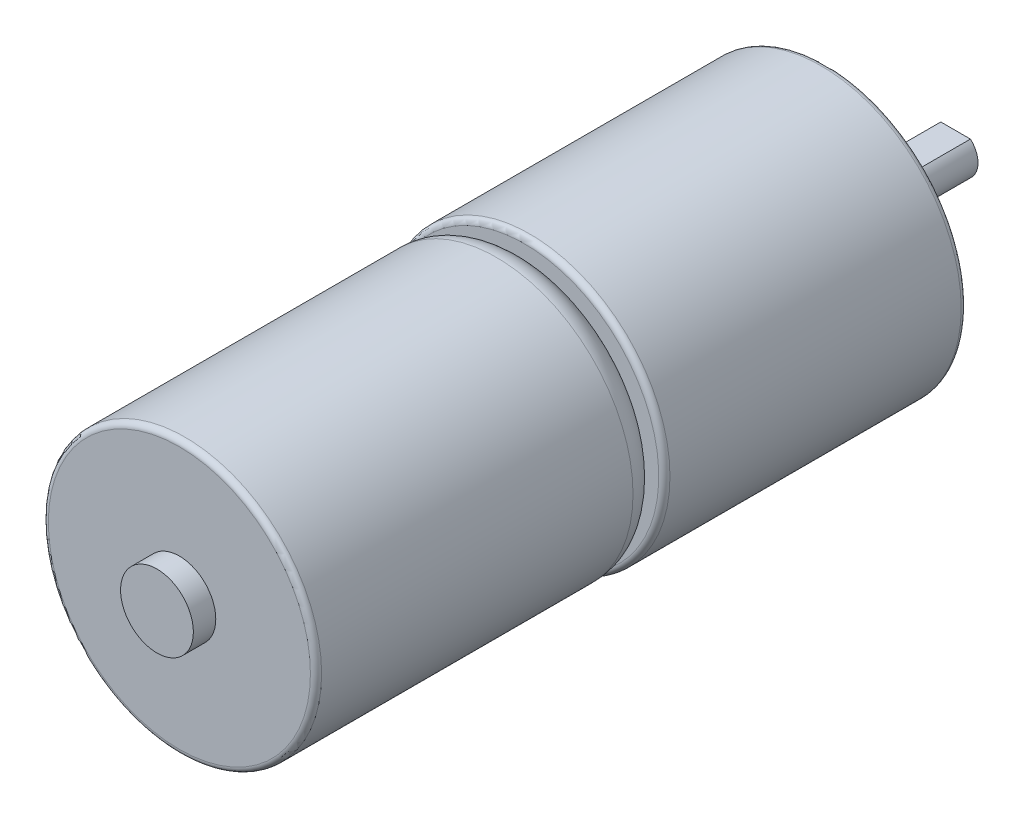
ISO-10303-21;
HEADER;
FILE_DESCRIPTION(('STEP AP214'),'2;1');
FILE_NAME('part.step','',(''),(''),'','','');
FILE_SCHEMA(('AUTOMOTIVE_DESIGN { 1 0 10303 214 1 1 1 1 }'));
ENDSEC;
DATA;
#1=APPLICATION_CONTEXT('core data for automotive mechanical design processes');
#2=APPLICATION_PROTOCOL_DEFINITION('international standard','automotive_design',2000,#1);
#3=PRODUCT_CONTEXT('',#1,'mechanical');
#4=PRODUCT('Part','Part','',(#3));
#5=PRODUCT_RELATED_PRODUCT_CATEGORY('part','',(#4));
#6=PRODUCT_DEFINITION_FORMATION('','',#4);
#7=PRODUCT_DEFINITION_CONTEXT('part definition',#1,'design');
#8=PRODUCT_DEFINITION('design','',#6,#7);
#9=PRODUCT_DEFINITION_SHAPE('','',#8);
#10=(LENGTH_UNIT() NAMED_UNIT(*) SI_UNIT(.MILLI.,.METRE.));
#11=(NAMED_UNIT(*) PLANE_ANGLE_UNIT() SI_UNIT($,.RADIAN.));
#12=(NAMED_UNIT(*) SI_UNIT($,.STERADIAN.) SOLID_ANGLE_UNIT());
#13=UNCERTAINTY_MEASURE_WITH_UNIT(LENGTH_MEASURE(1.E-05),#10,'distance_accuracy_value','');
#14=(GEOMETRIC_REPRESENTATION_CONTEXT(3) GLOBAL_UNCERTAINTY_ASSIGNED_CONTEXT((#13)) GLOBAL_UNIT_ASSIGNED_CONTEXT((#10,
#11,#12)) REPRESENTATION_CONTEXT('',''));
#15=CARTESIAN_POINT('',(0.,0.,0.));
#16=DIRECTION('',(0.,0.,1.));
#17=DIRECTION('',(1.,0.,0.));
#18=AXIS2_PLACEMENT_3D('',#15,#16,#17);
#19=CARTESIAN_POINT('',(0.,0.,30.8));
#20=DIRECTION('',(0.,0.,-1.));
#21=DIRECTION('',(-1.,0.,0.));
#22=AXIS2_PLACEMENT_3D('',#19,#20,#21);
#23=CYLINDRICAL_SURFACE('',#22,12.2);
#24=CARTESIAN_POINT('',(0.,0.,30.3));
#25=DIRECTION('',(0.,0.,1.));
#26=DIRECTION('',(1.,0.,0.));
#27=AXIS2_PLACEMENT_3D('',#24,#25,#26);
#28=CIRCLE('',#27,12.2);
#29=CARTESIAN_POINT('',(-12.2,0.,30.3));
#30=VERTEX_POINT('',#29);
#31=EDGE_CURVE('E105',#30,#30,#28,.F.);
#32=CARTESIAN_POINT('',(0.,0.,2.5));
#33=DIRECTION('',(0.,0.,1.));
#34=DIRECTION('',(1.,0.,0.));
#35=AXIS2_PLACEMENT_3D('',#32,#33,#34);
#36=CIRCLE('',#35,12.2);
#37=CARTESIAN_POINT('',(-12.2,0.,2.49999999999999));
#38=VERTEX_POINT('',#37);
#39=EDGE_CURVE('E98',#38,#38,#36,.T.);
#40=CARTESIAN_POINT('',(-12.2,0.,30.3));
#41=CARTESIAN_POINT('',(-12.2,0.,30.0104166666667));
#42=CARTESIAN_POINT('',(-12.2,0.,29.7208333333333));
#43=CARTESIAN_POINT('',(-12.2,0.,29.1416666666667));
#44=CARTESIAN_POINT('',(-12.2,0.,28.8520833333333));
#45=CARTESIAN_POINT('',(-12.2,0.,28.2729166666667));
#46=CARTESIAN_POINT('',(-12.2,0.,27.9833333333333));
#47=CARTESIAN_POINT('',(-12.2,0.,27.4041666666667));
#48=CARTESIAN_POINT('',(-12.2,0.,27.1145833333333));
#49=CARTESIAN_POINT('',(-12.2,0.,26.5354166666667));
#50=CARTESIAN_POINT('',(-12.2,0.,26.2458333333333));
#51=CARTESIAN_POINT('',(-12.2,0.,25.6666666666667));
#52=CARTESIAN_POINT('',(-12.2,0.,25.3770833333333));
#53=CARTESIAN_POINT('',(-12.2,0.,24.7979166666667));
#54=CARTESIAN_POINT('',(-12.2,0.,24.5083333333333));
#55=CARTESIAN_POINT('',(-12.2,0.,23.9291666666667));
#56=CARTESIAN_POINT('',(-12.2,0.,23.6395833333333));
#57=CARTESIAN_POINT('',(-12.2,0.,23.0604166666667));
#58=CARTESIAN_POINT('',(-12.2,0.,22.7708333333333));
#59=CARTESIAN_POINT('',(-12.2,0.,22.1916666666667));
#60=CARTESIAN_POINT('',(-12.2,0.,21.9020833333333));
#61=CARTESIAN_POINT('',(-12.2,0.,21.3229166666667));
#62=CARTESIAN_POINT('',(-12.2,0.,21.0333333333333));
#63=CARTESIAN_POINT('',(-12.2,0.,20.4541666666667));
#64=CARTESIAN_POINT('',(-12.2,0.,20.1645833333333));
#65=CARTESIAN_POINT('',(-12.2,0.,19.5854166666667));
#66=CARTESIAN_POINT('',(-12.2,0.,19.2958333333333));
#67=CARTESIAN_POINT('',(-12.2,0.,18.7166666666667));
#68=CARTESIAN_POINT('',(-12.2,0.,18.4270833333333));
#69=CARTESIAN_POINT('',(-12.2,0.,17.8479166666667));
#70=CARTESIAN_POINT('',(-12.2,0.,17.5583333333333));
#71=CARTESIAN_POINT('',(-12.2,0.,16.9791666666667));
#72=CARTESIAN_POINT('',(-12.2,0.,16.6895833333333));
#73=CARTESIAN_POINT('',(-12.2,0.,16.1104166666667));
#74=CARTESIAN_POINT('',(-12.2,0.,15.8208333333333));
#75=CARTESIAN_POINT('',(-12.2,0.,15.2416666666667));
#76=CARTESIAN_POINT('',(-12.2,0.,14.9520833333333));
#77=CARTESIAN_POINT('',(-12.2,0.,14.3729166666667));
#78=CARTESIAN_POINT('',(-12.2,0.,14.0833333333333));
#79=CARTESIAN_POINT('',(-12.2,0.,13.5041666666667));
#80=CARTESIAN_POINT('',(-12.2,0.,13.2145833333333));
#81=CARTESIAN_POINT('',(-12.2,0.,12.6354166666667));
#82=CARTESIAN_POINT('',(-12.2,0.,12.3458333333333));
#83=CARTESIAN_POINT('',(-12.2,0.,11.7666666666667));
#84=CARTESIAN_POINT('',(-12.2,0.,11.4770833333333));
#85=CARTESIAN_POINT('',(-12.2,0.,10.8979166666667));
#86=CARTESIAN_POINT('',(-12.2,0.,10.6083333333333));
#87=CARTESIAN_POINT('',(-12.2,0.,10.0291666666667));
#88=CARTESIAN_POINT('',(-12.2,0.,9.73958333333333));
#89=CARTESIAN_POINT('',(-12.2,0.,9.16041666666666));
#90=CARTESIAN_POINT('',(-12.2,0.,8.87083333333333));
#91=CARTESIAN_POINT('',(-12.2,0.,8.29166666666666));
#92=CARTESIAN_POINT('',(-12.2,0.,8.00208333333333));
#93=CARTESIAN_POINT('',(-12.2,0.,7.42291666666666));
#94=CARTESIAN_POINT('',(-12.2,0.,7.13333333333333));
#95=CARTESIAN_POINT('',(-12.2,0.,6.55416666666666));
#96=CARTESIAN_POINT('',(-12.2,0.,6.26458333333333));
#97=CARTESIAN_POINT('',(-12.2,0.,5.68541666666666));
#98=CARTESIAN_POINT('',(-12.2,0.,5.39583333333333));
#99=CARTESIAN_POINT('',(-12.2,0.,4.81666666666666));
#100=CARTESIAN_POINT('',(-12.2,0.,4.52708333333332));
#101=CARTESIAN_POINT('',(-12.2,0.,3.94791666666666));
#102=CARTESIAN_POINT('',(-12.2,0.,3.65833333333333));
#103=CARTESIAN_POINT('',(-12.2,0.,3.07916666666666));
#104=CARTESIAN_POINT('',(-12.2,0.,2.78958333333333));
#105=CARTESIAN_POINT('',(-12.2,0.,2.49999999999999));
#106=B_SPLINE_CURVE_WITH_KNOTS('',3,(#40,#41,#42,#43,#44,#45,#46,#47,#48,#49,#50,#51,#52,#53,
#54,#55,#56,#57,#58,#59,#60,#61,#62,#63,#64,#65,#66,#67,#68,#69,#70,#71,#72,#73,#74,#75,#76,#77,
#78,#79,#80,#81,#82,#83,#84,#85,#86,#87,#88,#89,#90,#91,#92,#93,#94,#95,#96,#97,#98,#99,#100,
#101,#102,#103,#104,#105),.UNSPECIFIED.,.F.,.F.,(4,2,2,2,2,2,2,2,2,2,2,2,2,2,2,2,2,2,2,2,2,2,2,
2,2,2,2,2,2,2,2,2,4),(0.,0.868749999999998,1.7375,2.60625,3.475,4.34375,5.2125,6.08125,6.95,
7.81875,8.6875,9.55625,10.425,11.29375,12.1625,13.03125,13.9,14.76875,15.6375,16.50625,17.375,
18.24375,19.1125,19.98125,20.85,21.71875,22.5875,23.45625,24.325,25.19375,26.0625,26.93125,
27.8),.UNSPECIFIED.);
#107=EDGE_CURVE('BSEAM35',#30,#38,#106,.T.);
#108=ORIENTED_EDGE('',*,*,#31,.T.);
#109=ORIENTED_EDGE('',*,*,#39,.T.);
#110=ORIENTED_EDGE('',*,*,#107,.T.);
#111=ORIENTED_EDGE('',*,*,#107,.F.);
#112=EDGE_LOOP('',(#108,#110,#109,#111));
#113=FACE_BOUND('',#112,.T.);
#114=ADVANCED_FACE('F35',(#113),#23,.T.);
#115=CARTESIAN_POINT('',(0.,0.,30.8));
#116=DIRECTION('',(0.,0.,1.));
#117=DIRECTION('',(1.,0.,0.));
#118=AXIS2_PLACEMENT_3D('',#115,#116,#117);
#119=PLANE('',#118);
#120=CARTESIAN_POINT('',(0.,0.,30.8));
#121=DIRECTION('',(0.,0.,1.));
#122=DIRECTION('',(1.,0.,0.));
#123=AXIS2_PLACEMENT_3D('',#120,#121,#122);
#124=CIRCLE('',#123,11.7);
#125=CARTESIAN_POINT('',(11.7,0.,30.8));
#126=VERTEX_POINT('',#125);
#127=EDGE_CURVE('E87',#126,#126,#124,.T.);
#128=ORIENTED_EDGE('',*,*,#127,.T.);
#129=EDGE_LOOP('',(#128));
#130=FACE_BOUND('',#129,.T.);
#131=CARTESIAN_POINT('',(0.,0.,30.8));
#132=DIRECTION('',(0.,0.,1.));
#133=DIRECTION('',(1.,0.,0.));
#134=AXIS2_PLACEMENT_3D('',#131,#132,#133);
#135=CIRCLE('',#134,3.25);
#136=CARTESIAN_POINT('',(3.25,0.,30.8));
#137=VERTEX_POINT('',#136);
#138=EDGE_CURVE('E95',#137,#137,#135,.T.);
#139=ORIENTED_EDGE('',*,*,#138,.F.);
#140=EDGE_LOOP('',(#139));
#141=FACE_BOUND('',#140,.T.);
#142=ADVANCED_FACE('F168',(#130,#141),#119,.T.);
#143=CARTESIAN_POINT('',(0.,0.,32.8));
#144=DIRECTION('',(0.,0.,-1.));
#145=DIRECTION('',(-1.,0.,0.));
#146=AXIS2_PLACEMENT_3D('',#143,#144,#145);
#147=CYLINDRICAL_SURFACE('',#146,3.25);
#148=CARTESIAN_POINT('',(0.,0.,32.8));
#149=DIRECTION('',(0.,0.,1.));
#150=DIRECTION('',(1.,0.,0.));
#151=AXIS2_PLACEMENT_3D('',#148,#149,#150);
#152=CIRCLE('',#151,3.25);
#153=CARTESIAN_POINT('',(3.25,0.,32.8));
#154=VERTEX_POINT('',#153);
#155=EDGE_CURVE('E81',#154,#154,#152,.T.);
#156=ORIENTED_EDGE('',*,*,#155,.F.);
#157=EDGE_LOOP('',(#156));
#158=FACE_BOUND('',#157,.T.);
#159=ORIENTED_EDGE('',*,*,#138,.T.);
#160=EDGE_LOOP('',(#159));
#161=FACE_BOUND('',#160,.T.);
#162=ADVANCED_FACE('F174',(#158,#161),#147,.T.);
#163=CARTESIAN_POINT('',(0.,0.,32.8));
#164=DIRECTION('',(0.,0.,1.));
#165=DIRECTION('',(1.,0.,0.));
#166=AXIS2_PLACEMENT_3D('',#163,#164,#165);
#167=PLANE('',#166);
#168=ORIENTED_EDGE('',*,*,#155,.T.);
#169=EDGE_LOOP('',(#168));
#170=FACE_BOUND('',#169,.T.);
#171=ADVANCED_FACE('F184',(#170),#167,.T.);
#172=CARTESIAN_POINT('',(0.,0.,2.5));
#173=DIRECTION('',(0.,0.,1.));
#174=DIRECTION('',(1.,0.,0.));
#175=AXIS2_PLACEMENT_3D('',#172,#173,#174);
#176=TOROIDAL_SURFACE('',#175,9.7,2.5);
#177=CARTESIAN_POINT('',(0.,0.,0.));
#178=DIRECTION('',(0.,0.,1.));
#179=DIRECTION('',(1.,0.,0.));
#180=AXIS2_PLACEMENT_3D('',#177,#178,#179);
#181=CIRCLE('',#180,9.7);
#182=CARTESIAN_POINT('',(9.7,0.,0.));
#183=VERTEX_POINT('',#182);
#184=EDGE_CURVE('E92',#183,#183,#181,.F.);
#185=ORIENTED_EDGE('',*,*,#184,.F.);
#186=EDGE_LOOP('',(#185));
#187=FACE_BOUND('',#186,.T.);
#188=ORIENTED_EDGE('',*,*,#39,.F.);
#189=EDGE_LOOP('',(#188));
#190=FACE_BOUND('',#189,.T.);
#191=ADVANCED_FACE('F180',(#187,#190),#176,.T.);
#192=CARTESIAN_POINT('',(0.,0.,-27.));
#193=DIRECTION('',(0.,0.,1.));
#194=DIRECTION('',(1.,0.,0.));
#195=AXIS2_PLACEMENT_3D('',#192,#193,#194);
#196=CYLINDRICAL_SURFACE('',#195,12.5);
#197=CARTESIAN_POINT('',(0.,0.,-26.5));
#198=DIRECTION('',(0.,0.,-1.));
#199=DIRECTION('',(-1.,0.,0.));
#200=AXIS2_PLACEMENT_3D('',#197,#198,#199);
#201=CIRCLE('',#200,12.5);
#202=CARTESIAN_POINT('',(-12.5,0.,-26.5));
#203=VERTEX_POINT('',#202);
#204=EDGE_CURVE('E44',#203,#203,#201,.F.);
#205=ORIENTED_EDGE('',*,*,#204,.T.);
#206=EDGE_LOOP('',(#205));
#207=FACE_BOUND('',#206,.T.);
#208=CARTESIAN_POINT('',(0.,0.,-0.5));
#209=DIRECTION('',(0.,0.,-1.));
#210=DIRECTION('',(-1.,0.,0.));
#211=AXIS2_PLACEMENT_3D('',#208,#209,#210);
#212=CIRCLE('',#211,12.5);
#213=CARTESIAN_POINT('',(-12.5,0.,-0.5));
#214=VERTEX_POINT('',#213);
#215=EDGE_CURVE('E111',#214,#214,#212,.T.);
#216=ORIENTED_EDGE('',*,*,#215,.T.);
#217=EDGE_LOOP('',(#216));
#218=FACE_BOUND('',#217,.T.);
#219=ADVANCED_FACE('F183',(#207,#218),#196,.T.);
#220=CARTESIAN_POINT('',(0.,0.,-27.));
#221=DIRECTION('',(0.,0.,-1.));
#222=DIRECTION('',(-1.,0.,0.));
#223=AXIS2_PLACEMENT_3D('',#220,#221,#222);
#224=PLANE('',#223);
#225=CARTESIAN_POINT('',(0.,8.5,-27.));
#226=DIRECTION('',(0.,0.,-1.));
#227=DIRECTION('',(-1.,0.,0.));
#228=AXIS2_PLACEMENT_3D('',#225,#226,#227);
#229=CIRCLE('',#228,3.25);
#230=CARTESIAN_POINT('',(-3.25,8.5,-27.));
#231=VERTEX_POINT('',#230);
#232=EDGE_CURVE('E123',#231,#231,#229,.T.);
#233=ORIENTED_EDGE('',*,*,#232,.F.);
#234=EDGE_LOOP('',(#233));
#235=FACE_BOUND('',#234,.T.);
#236=CARTESIAN_POINT('',(0.,-8.5,-27.));
#237=DIRECTION('',(0.,0.,-1.));
#238=DIRECTION('',(-1.,0.,0.));
#239=AXIS2_PLACEMENT_3D('',#236,#237,#238);
#240=CIRCLE('',#239,3.25);
#241=CARTESIAN_POINT('',(-3.25,-8.5,-27.));
#242=VERTEX_POINT('',#241);
#243=EDGE_CURVE('E133',#242,#242,#240,.T.);
#244=ORIENTED_EDGE('',*,*,#243,.F.);
#245=EDGE_LOOP('',(#244));
#246=FACE_BOUND('',#245,.T.);
#247=CARTESIAN_POINT('',(0.,0.,-27.));
#248=DIRECTION('',(0.,0.,-1.));
#249=DIRECTION('',(-1.,0.,0.));
#250=AXIS2_PLACEMENT_3D('',#247,#248,#249);
#251=CIRCLE('',#250,12.);
#252=CARTESIAN_POINT('',(-12.,0.,-27.));
#253=VERTEX_POINT('',#252);
#254=EDGE_CURVE('E108',#253,#253,#251,.T.);
#255=ORIENTED_EDGE('',*,*,#254,.T.);
#256=EDGE_LOOP('',(#255));
#257=FACE_BOUND('',#256,.T.);
#258=CARTESIAN_POINT('',(-8.5,0.,-27.));
#259=DIRECTION('',(0.,0.,-1.));
#260=DIRECTION('',(-1.,0.,0.));
#261=AXIS2_PLACEMENT_3D('',#258,#259,#260);
#262=CIRCLE('',#261,1.5);
#263=CARTESIAN_POINT('',(-10.,0.,-27.));
#264=VERTEX_POINT('',#263);
#265=EDGE_CURVE('E141',#264,#264,#262,.T.);
#266=ORIENTED_EDGE('',*,*,#265,.F.);
#267=EDGE_LOOP('',(#266));
#268=FACE_BOUND('',#267,.T.);
#269=CARTESIAN_POINT('',(8.5,0.,-27.));
#270=DIRECTION('',(0.,0.,-1.));
#271=DIRECTION('',(-1.,0.,0.));
#272=AXIS2_PLACEMENT_3D('',#269,#270,#271);
#273=CIRCLE('',#272,1.5);
#274=CARTESIAN_POINT('',(7.,0.,-27.));
#275=VERTEX_POINT('',#274);
#276=EDGE_CURVE('E121',#275,#275,#273,.T.);
#277=ORIENTED_EDGE('',*,*,#276,.F.);
#278=EDGE_LOOP('',(#277));
#279=FACE_BOUND('',#278,.T.);
#280=CARTESIAN_POINT('',(0.,0.,-27.));
#281=DIRECTION('',(0.,0.,-1.));
#282=DIRECTION('',(-1.,0.,0.));
#283=AXIS2_PLACEMENT_3D('',#280,#281,#282);
#284=CIRCLE('',#283,3.5);
#285=CARTESIAN_POINT('',(-3.5,0.,-27.));
#286=VERTEX_POINT('',#285);
#287=EDGE_CURVE('E88',#286,#286,#284,.T.);
#288=ORIENTED_EDGE('',*,*,#287,.F.);
#289=EDGE_LOOP('',(#288));
#290=FACE_BOUND('',#289,.T.);
#291=ADVANCED_FACE('F202',(#235,#246,#257,#268,#279,#290),#224,.T.);
#292=CARTESIAN_POINT('',(0.,0.,0.));
#293=DIRECTION('',(0.,0.,-1.));
#294=DIRECTION('',(-1.,0.,0.));
#295=AXIS2_PLACEMENT_3D('',#292,#293,#294);
#296=PLANE('',#295);
#297=CARTESIAN_POINT('',(0.,0.,0.));
#298=DIRECTION('',(0.,0.,-1.));
#299=DIRECTION('',(-1.,0.,0.));
#300=AXIS2_PLACEMENT_3D('',#297,#298,#299);
#301=CIRCLE('',#300,12.);
#302=CARTESIAN_POINT('',(-12.,0.,0.));
#303=VERTEX_POINT('',#302);
#304=EDGE_CURVE('E11',#303,#303,#301,.F.);
#305=ORIENTED_EDGE('',*,*,#304,.T.);
#306=EDGE_LOOP('',(#305));
#307=FACE_BOUND('',#306,.T.);
#308=ORIENTED_EDGE('',*,*,#184,.T.);
#309=EDGE_LOOP('',(#308));
#310=FACE_BOUND('',#309,.T.);
#311=ADVANCED_FACE('F205',(#307,#310),#296,.F.);
#312=CARTESIAN_POINT('',(0.,0.,-29.5));
#313=DIRECTION('',(0.,0.,1.));
#314=DIRECTION('',(1.,0.,0.));
#315=AXIS2_PLACEMENT_3D('',#312,#313,#314);
#316=CYLINDRICAL_SURFACE('',#315,3.5);
#317=CARTESIAN_POINT('',(0.,0.,-29.5));
#318=DIRECTION('',(0.,0.,-1.));
#319=DIRECTION('',(-1.,0.,0.));
#320=AXIS2_PLACEMENT_3D('',#317,#318,#319);
#321=CIRCLE('',#320,3.5);
#322=CARTESIAN_POINT('',(-3.5,0.,-29.5));
#323=VERTEX_POINT('',#322);
#324=EDGE_CURVE('E78',#323,#323,#321,.T.);
#325=ORIENTED_EDGE('',*,*,#324,.F.);
#326=EDGE_LOOP('',(#325));
#327=FACE_BOUND('',#326,.T.);
#328=ORIENTED_EDGE('',*,*,#287,.T.);
#329=EDGE_LOOP('',(#328));
#330=FACE_BOUND('',#329,.T.);
#331=ADVANCED_FACE('F214',(#327,#330),#316,.T.);
#332=CARTESIAN_POINT('',(0.,0.,-29.5));
#333=DIRECTION('',(0.,0.,-1.));
#334=DIRECTION('',(-1.,0.,0.));
#335=AXIS2_PLACEMENT_3D('',#332,#333,#334);
#336=PLANE('',#335);
#337=CARTESIAN_POINT('',(0.,0.,-29.5));
#338=DIRECTION('',(0.,0.,-1.));
#339=DIRECTION('',(-1.,0.,0.));
#340=AXIS2_PLACEMENT_3D('',#337,#338,#339);
#341=CIRCLE('',#340,2.);
#342=CARTESIAN_POINT('',(-2.,0.,-29.5));
#343=VERTEX_POINT('',#342);
#344=EDGE_CURVE('E85',#343,#343,#341,.T.);
#345=ORIENTED_EDGE('',*,*,#344,.F.);
#346=EDGE_LOOP('',(#345));
#347=FACE_BOUND('',#346,.T.);
#348=ORIENTED_EDGE('',*,*,#324,.T.);
#349=EDGE_LOOP('',(#348));
#350=FACE_BOUND('',#349,.T.);
#351=ADVANCED_FACE('F216',(#347,#350),#336,.T.);
#352=CARTESIAN_POINT('',(0.,0.,-38.5));
#353=DIRECTION('',(0.,0.,1.));
#354=DIRECTION('',(1.,0.,0.));
#355=AXIS2_PLACEMENT_3D('',#352,#353,#354);
#356=CYLINDRICAL_SURFACE('',#355,2.);
#357=CARTESIAN_POINT('',(0.,0.,-38.5));
#358=DIRECTION('',(0.,0.,-1.));
#359=DIRECTION('',(-1.,0.,0.));
#360=AXIS2_PLACEMENT_3D('',#357,#358,#359);
#361=CIRCLE('',#360,2.);
#362=CARTESIAN_POINT('',(1.3228756555323,1.5,-38.5));
#363=VERTEX_POINT('',#362);
#364=CARTESIAN_POINT('',(-1.3228756555323,1.5,-38.5));
#365=VERTEX_POINT('',#364);
#366=EDGE_CURVE('E75',#363,#365,#361,.T.);
#367=ORIENTED_EDGE('',*,*,#366,.F.);
#368=DIRECTION('',(0.,0.,-1.));
#369=VECTOR('',#368,1.);
#370=CARTESIAN_POINT('',(1.3228756555323,1.5,-30.5));
#371=LINE('',#370,#369);
#372=CARTESIAN_POINT('',(1.3228756555323,1.5,-30.5));
#373=VERTEX_POINT('',#372);
#374=EDGE_CURVE('E52',#373,#363,#371,.T.);
#375=ORIENTED_EDGE('',*,*,#374,.F.);
#376=CARTESIAN_POINT('',(0.,0.,-30.5));
#377=DIRECTION('',(0.,0.,-1.));
#378=DIRECTION('',(-1.,0.,0.));
#379=AXIS2_PLACEMENT_3D('',#376,#377,#378);
#380=CIRCLE('',#379,2.);
#381=CARTESIAN_POINT('',(-1.3228756555323,1.5,-30.5));
#382=VERTEX_POINT('',#381);
#383=EDGE_CURVE('E68',#382,#373,#380,.T.);
#384=ORIENTED_EDGE('',*,*,#383,.F.);
#385=DIRECTION('',(0.,0.,-1.));
#386=VECTOR('',#385,1.);
#387=CARTESIAN_POINT('',(-1.3228756555323,1.5,-30.5));
#388=LINE('',#387,#386);
#389=EDGE_CURVE('E58',#382,#365,#388,.T.);
#390=ORIENTED_EDGE('',*,*,#389,.T.);
#391=EDGE_LOOP('',(#367,#375,#384,#390));
#392=FACE_BOUND('',#391,.T.);
#393=ORIENTED_EDGE('',*,*,#344,.T.);
#394=EDGE_LOOP('',(#393));
#395=FACE_BOUND('',#394,.T.);
#396=ADVANCED_FACE('F73',(#392,#395),#356,.T.);
#397=CARTESIAN_POINT('',(0.,0.,-38.5));
#398=DIRECTION('',(0.,0.,-1.));
#399=DIRECTION('',(-1.,0.,0.));
#400=AXIS2_PLACEMENT_3D('',#397,#398,#399);
#401=PLANE('',#400);
#402=DIRECTION('',(-1.,0.,0.));
#403=VECTOR('',#402,1.);
#404=CARTESIAN_POINT('',(1.3228756555323,1.5,-38.5));
#405=LINE('',#404,#403);
#406=EDGE_CURVE('E63',#363,#365,#405,.T.);
#407=ORIENTED_EDGE('',*,*,#406,.F.);
#408=ORIENTED_EDGE('',*,*,#366,.T.);
#409=EDGE_LOOP('',(#407,#408));
#410=FACE_BOUND('',#409,.T.);
#411=ADVANCED_FACE('F77',(#410),#401,.T.);
#412=CARTESIAN_POINT('',(1.3228756555323,1.5,-30.5));
#413=DIRECTION('',(0.,-1.,0.));
#414=DIRECTION('',(0.,0.,-1.));
#415=AXIS2_PLACEMENT_3D('',#412,#413,#414);
#416=PLANE('',#415);
#417=ORIENTED_EDGE('',*,*,#406,.T.);
#418=ORIENTED_EDGE('',*,*,#389,.F.);
#419=DIRECTION('',(-1.,0.,0.));
#420=VECTOR('',#419,1.);
#421=CARTESIAN_POINT('',(1.3228756555323,1.5,-30.5));
#422=LINE('',#421,#420);
#423=EDGE_CURVE('E153',#373,#382,#422,.T.);
#424=ORIENTED_EDGE('',*,*,#423,.F.);
#425=ORIENTED_EDGE('',*,*,#374,.T.);
#426=EDGE_LOOP('',(#417,#418,#424,#425));
#427=FACE_BOUND('',#426,.T.);
#428=ADVANCED_FACE('F64',(#427),#416,.F.);
#429=CARTESIAN_POINT('',(0.,0.,-30.5));
#430=DIRECTION('',(0.,0.,-1.));
#431=DIRECTION('',(-1.,0.,0.));
#432=AXIS2_PLACEMENT_3D('',#429,#430,#431);
#433=PLANE('',#432);
#434=ORIENTED_EDGE('',*,*,#383,.T.);
#435=ORIENTED_EDGE('',*,*,#423,.T.);
#436=EDGE_LOOP('',(#434,#435));
#437=FACE_BOUND('',#436,.T.);
#438=ADVANCED_FACE('F155',(#437),#433,.T.);
#439=CARTESIAN_POINT('',(8.5,0.,-9.));
#440=DIRECTION('',(0.,0.,-1.));
#441=DIRECTION('',(-1.,0.,0.));
#442=AXIS2_PLACEMENT_3D('',#439,#440,#441);
#443=CYLINDRICAL_SURFACE('',#442,1.5);
#444=CARTESIAN_POINT('',(8.5,0.,-9.));
#445=DIRECTION('',(0.,0.,-1.));
#446=DIRECTION('',(-1.,0.,0.));
#447=AXIS2_PLACEMENT_3D('',#444,#445,#446);
#448=CIRCLE('',#447,1.5);
#449=CARTESIAN_POINT('',(7.,0.,-9.));
#450=VERTEX_POINT('',#449);
#451=EDGE_CURVE('E147',#450,#450,#448,.T.);
#452=ORIENTED_EDGE('',*,*,#451,.F.);
#453=EDGE_LOOP('',(#452));
#454=FACE_BOUND('',#453,.T.);
#455=ORIENTED_EDGE('',*,*,#276,.T.);
#456=EDGE_LOOP('',(#455));
#457=FACE_BOUND('',#456,.T.);
#458=ADVANCED_FACE('F157',(#454,#457),#443,.F.);
#459=CARTESIAN_POINT('',(8.5,0.,-9.));
#460=DIRECTION('',(0.,0.,-1.));
#461=DIRECTION('',(-1.,0.,0.));
#462=AXIS2_PLACEMENT_3D('',#459,#460,#461);
#463=PLANE('',#462);
#464=ORIENTED_EDGE('',*,*,#451,.T.);
#465=EDGE_LOOP('',(#464));
#466=FACE_BOUND('',#465,.T.);
#467=ADVANCED_FACE('F163',(#466),#463,.T.);
#468=CARTESIAN_POINT('',(-8.5,0.,-9.));
#469=DIRECTION('',(0.,0.,-1.));
#470=DIRECTION('',(-1.,0.,0.));
#471=AXIS2_PLACEMENT_3D('',#468,#469,#470);
#472=CYLINDRICAL_SURFACE('',#471,1.5);
#473=CARTESIAN_POINT('',(-8.5,0.,-9.));
#474=DIRECTION('',(0.,0.,-1.));
#475=DIRECTION('',(-1.,0.,0.));
#476=AXIS2_PLACEMENT_3D('',#473,#474,#475);
#477=CIRCLE('',#476,1.5);
#478=CARTESIAN_POINT('',(-10.,0.,-9.));
#479=VERTEX_POINT('',#478);
#480=EDGE_CURVE('E138',#479,#479,#477,.T.);
#481=ORIENTED_EDGE('',*,*,#480,.F.);
#482=EDGE_LOOP('',(#481));
#483=FACE_BOUND('',#482,.T.);
#484=ORIENTED_EDGE('',*,*,#265,.T.);
#485=EDGE_LOOP('',(#484));
#486=FACE_BOUND('',#485,.T.);
#487=ADVANCED_FACE('F369',(#483,#486),#472,.F.);
#488=CARTESIAN_POINT('',(-8.5,0.,-9.));
#489=DIRECTION('',(0.,0.,-1.));
#490=DIRECTION('',(-1.,0.,0.));
#491=AXIS2_PLACEMENT_3D('',#488,#489,#490);
#492=PLANE('',#491);
#493=ORIENTED_EDGE('',*,*,#480,.T.);
#494=EDGE_LOOP('',(#493));
#495=FACE_BOUND('',#494,.T.);
#496=ADVANCED_FACE('F189',(#495),#492,.T.);
#497=CARTESIAN_POINT('',(0.,0.,30.3));
#498=DIRECTION('',(0.,0.,1.));
#499=DIRECTION('',(1.,0.,0.));
#500=AXIS2_PLACEMENT_3D('',#497,#498,#499);
#501=TOROIDAL_SURFACE('',#500,11.7,0.5);
#502=ORIENTED_EDGE('',*,*,#31,.F.);
#503=EDGE_LOOP('',(#502));
#504=FACE_BOUND('',#503,.T.);
#505=ORIENTED_EDGE('',*,*,#127,.F.);
#506=EDGE_LOOP('',(#505));
#507=FACE_BOUND('',#506,.T.);
#508=ADVANCED_FACE('F186',(#504,#507),#501,.T.);
#509=CARTESIAN_POINT('',(0.,0.,-26.5));
#510=DIRECTION('',(0.,0.,-1.));
#511=DIRECTION('',(-1.,0.,0.));
#512=AXIS2_PLACEMENT_3D('',#509,#510,#511);
#513=TOROIDAL_SURFACE('',#512,12.,0.5);
#514=ORIENTED_EDGE('',*,*,#204,.F.);
#515=EDGE_LOOP('',(#514));
#516=FACE_BOUND('',#515,.T.);
#517=ORIENTED_EDGE('',*,*,#254,.F.);
#518=EDGE_LOOP('',(#517));
#519=FACE_BOUND('',#518,.T.);
#520=ADVANCED_FACE('F188',(#516,#519),#513,.T.);
#521=CARTESIAN_POINT('',(0.,0.,-0.5));
#522=DIRECTION('',(0.,0.,-1.));
#523=DIRECTION('',(-1.,0.,0.));
#524=AXIS2_PLACEMENT_3D('',#521,#522,#523);
#525=TOROIDAL_SURFACE('',#524,12.,0.5);
#526=ORIENTED_EDGE('',*,*,#304,.F.);
#527=EDGE_LOOP('',(#526));
#528=FACE_BOUND('',#527,.T.);
#529=ORIENTED_EDGE('',*,*,#215,.F.);
#530=EDGE_LOOP('',(#529));
#531=FACE_BOUND('',#530,.T.);
#532=ADVANCED_FACE('F37',(#528,#531),#525,.T.);
#533=CARTESIAN_POINT('',(0.,8.5,-22.));
#534=DIRECTION('',(0.,0.,-1.));
#535=DIRECTION('',(-1.,0.,0.));
#536=AXIS2_PLACEMENT_3D('',#533,#534,#535);
#537=PLANE('',#536);
#538=CARTESIAN_POINT('',(0.,8.5,-22.));
#539=DIRECTION('',(0.,0.,-1.));
#540=DIRECTION('',(-1.,0.,0.));
#541=AXIS2_PLACEMENT_3D('',#538,#539,#540);
#542=CIRCLE('',#541,3.25);
#543=CARTESIAN_POINT('',(-3.25,8.5,-22.));
#544=VERTEX_POINT('',#543);
#545=EDGE_CURVE('E117',#544,#544,#542,.T.);
#546=ORIENTED_EDGE('',*,*,#545,.T.);
#547=EDGE_LOOP('',(#546));
#548=FACE_BOUND('',#547,.T.);
#549=CARTESIAN_POINT('',(0.,8.5,-22.));
#550=DIRECTION('',(0.,0.,-1.));
#551=DIRECTION('',(-1.,0.,0.));
#552=AXIS2_PLACEMENT_3D('',#549,#550,#551);
#553=CIRCLE('',#552,1.5);
#554=CARTESIAN_POINT('',(-1.5,8.5,-22.));
#555=VERTEX_POINT('',#554);
#556=EDGE_CURVE('E115',#555,#555,#553,.F.);
#557=ORIENTED_EDGE('',*,*,#556,.T.);
#558=EDGE_LOOP('',(#557));
#559=FACE_BOUND('',#558,.T.);
#560=ADVANCED_FACE('F196',(#548,#559),#537,.T.);
#561=CARTESIAN_POINT('',(0.,8.5,-22.));
#562=DIRECTION('',(0.,0.,-1.));
#563=DIRECTION('',(-1.,0.,0.));
#564=AXIS2_PLACEMENT_3D('',#561,#562,#563);
#565=CYLINDRICAL_SURFACE('',#564,3.25);
#566=ORIENTED_EDGE('',*,*,#545,.F.);
#567=EDGE_LOOP('',(#566));
#568=FACE_BOUND('',#567,.T.);
#569=ORIENTED_EDGE('',*,*,#232,.T.);
#570=EDGE_LOOP('',(#569));
#571=FACE_BOUND('',#570,.T.);
#572=ADVANCED_FACE('F293',(#568,#571),#565,.F.);
#573=CARTESIAN_POINT('',(0.,-8.5,-22.));
#574=DIRECTION('',(0.,0.,-1.));
#575=DIRECTION('',(-1.,0.,0.));
#576=AXIS2_PLACEMENT_3D('',#573,#574,#575);
#577=PLANE('',#576);
#578=CARTESIAN_POINT('',(0.,-8.5,-22.));
#579=DIRECTION('',(0.,0.,-1.));
#580=DIRECTION('',(-1.,0.,0.));
#581=AXIS2_PLACEMENT_3D('',#578,#579,#580);
#582=CIRCLE('',#581,3.25);
#583=CARTESIAN_POINT('',(-3.25,-8.5,-22.));
#584=VERTEX_POINT('',#583);
#585=EDGE_CURVE('E128',#584,#584,#582,.T.);
#586=ORIENTED_EDGE('',*,*,#585,.T.);
#587=EDGE_LOOP('',(#586));
#588=FACE_BOUND('',#587,.T.);
#589=CARTESIAN_POINT('',(0.,-8.5,-22.));
#590=DIRECTION('',(0.,0.,-1.));
#591=DIRECTION('',(-1.,0.,0.));
#592=AXIS2_PLACEMENT_3D('',#589,#590,#591);
#593=CIRCLE('',#592,1.5);
#594=CARTESIAN_POINT('',(-1.5,-8.5,-22.));
#595=VERTEX_POINT('',#594);
#596=EDGE_CURVE('E39',#595,#595,#593,.F.);
#597=ORIENTED_EDGE('',*,*,#596,.T.);
#598=EDGE_LOOP('',(#597));
#599=FACE_BOUND('',#598,.T.);
#600=ADVANCED_FACE('F300',(#588,#599),#577,.T.);
#601=CARTESIAN_POINT('',(0.,-8.5,-22.));
#602=DIRECTION('',(0.,0.,-1.));
#603=DIRECTION('',(-1.,0.,0.));
#604=AXIS2_PLACEMENT_3D('',#601,#602,#603);
#605=CYLINDRICAL_SURFACE('',#604,3.25);
#606=ORIENTED_EDGE('',*,*,#585,.F.);
#607=EDGE_LOOP('',(#606));
#608=FACE_BOUND('',#607,.T.);
#609=ORIENTED_EDGE('',*,*,#243,.T.);
#610=EDGE_LOOP('',(#609));
#611=FACE_BOUND('',#610,.T.);
#612=ADVANCED_FACE('F308',(#608,#611),#605,.F.);
#613=CARTESIAN_POINT('',(0.,8.5,-9.));
#614=DIRECTION('',(0.,0.,-1.));
#615=DIRECTION('',(-1.,0.,0.));
#616=AXIS2_PLACEMENT_3D('',#613,#614,#615);
#617=PLANE('',#616);
#618=CARTESIAN_POINT('',(0.,8.5,-9.));
#619=DIRECTION('',(0.,0.,-1.));
#620=DIRECTION('',(-1.,0.,0.));
#621=AXIS2_PLACEMENT_3D('',#618,#619,#620);
#622=CIRCLE('',#621,1.5);
#623=CARTESIAN_POINT('',(-1.5,8.5,-9.));
#624=VERTEX_POINT('',#623);
#625=EDGE_CURVE('E69',#624,#624,#622,.T.);
#626=ORIENTED_EDGE('',*,*,#625,.T.);
#627=EDGE_LOOP('',(#626));
#628=FACE_BOUND('',#627,.T.);
#629=ADVANCED_FACE('F316',(#628),#617,.T.);
#630=CARTESIAN_POINT('',(0.,8.5,-9.));
#631=DIRECTION('',(0.,0.,-1.));
#632=DIRECTION('',(-1.,0.,0.));
#633=AXIS2_PLACEMENT_3D('',#630,#631,#632);
#634=CYLINDRICAL_SURFACE('',#633,1.5);
#635=ORIENTED_EDGE('',*,*,#625,.F.);
#636=EDGE_LOOP('',(#635));
#637=FACE_BOUND('',#636,.T.);
#638=ORIENTED_EDGE('',*,*,#556,.F.);
#639=EDGE_LOOP('',(#638));
#640=FACE_BOUND('',#639,.T.);
#641=ADVANCED_FACE('F325',(#637,#640),#634,.F.);
#642=CARTESIAN_POINT('',(0.,-8.5,-9.));
#643=DIRECTION('',(0.,0.,-1.));
#644=DIRECTION('',(-1.,0.,0.));
#645=AXIS2_PLACEMENT_3D('',#642,#643,#644);
#646=PLANE('',#645);
#647=CARTESIAN_POINT('',(0.,-8.5,-9.));
#648=DIRECTION('',(0.,0.,-1.));
#649=DIRECTION('',(-1.,0.,0.));
#650=AXIS2_PLACEMENT_3D('',#647,#648,#649);
#651=CIRCLE('',#650,1.5);
#652=CARTESIAN_POINT('',(-1.5,-8.5,-9.));
#653=VERTEX_POINT('',#652);
#654=EDGE_CURVE('E144',#653,#653,#651,.T.);
#655=ORIENTED_EDGE('',*,*,#654,.T.);
#656=EDGE_LOOP('',(#655));
#657=FACE_BOUND('',#656,.T.);
#658=ADVANCED_FACE('F332',(#657),#646,.T.);
#659=CARTESIAN_POINT('',(0.,-8.5,-9.));
#660=DIRECTION('',(0.,0.,-1.));
#661=DIRECTION('',(-1.,0.,0.));
#662=AXIS2_PLACEMENT_3D('',#659,#660,#661);
#663=CYLINDRICAL_SURFACE('',#662,1.5);
#664=ORIENTED_EDGE('',*,*,#654,.F.);
#665=EDGE_LOOP('',(#664));
#666=FACE_BOUND('',#665,.T.);
#667=ORIENTED_EDGE('',*,*,#596,.F.);
#668=EDGE_LOOP('',(#667));
#669=FACE_BOUND('',#668,.T.);
#670=ADVANCED_FACE('F340',(#666,#669),#663,.F.);
#671=CLOSED_SHELL('',(#114,#142,#162,#171,#191,#219,#291,#311,#331,#351,#396,#411,#428,#438,
#458,#467,#487,#496,#508,#520,#532,#560,#572,#600,#612,#629,#641,#658,#670));
#672=MANIFOLD_SOLID_BREP('B2',#671);
#673=ADVANCED_BREP_SHAPE_REPRESENTATION('',(#18,#672),#14);
#674=SHAPE_DEFINITION_REPRESENTATION(#9,#673);
ENDSEC;
END-ISO-10303-21;
